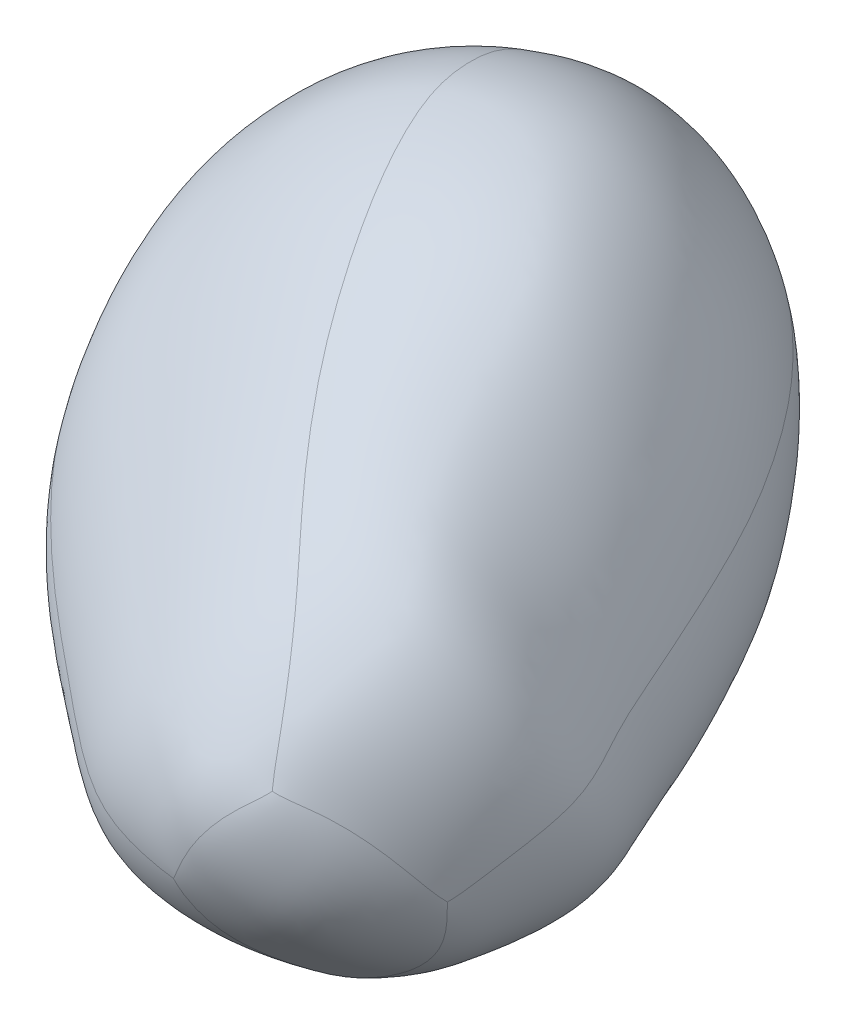
ISO-10303-21;
HEADER;
FILE_DESCRIPTION(('STEP AP214'),'2;1');
FILE_NAME('part.step','',(''),(''),'','','');
FILE_SCHEMA(('AUTOMOTIVE_DESIGN { 1 0 10303 214 1 1 1 1 }'));
ENDSEC;
DATA;
#1=APPLICATION_CONTEXT('core data for automotive mechanical design processes');
#2=APPLICATION_PROTOCOL_DEFINITION('international standard','automotive_design',2000,#1);
#3=PRODUCT_CONTEXT('',#1,'mechanical');
#4=PRODUCT('Part','Part','',(#3));
#5=PRODUCT_RELATED_PRODUCT_CATEGORY('part','',(#4));
#6=PRODUCT_DEFINITION_FORMATION('','',#4);
#7=PRODUCT_DEFINITION_CONTEXT('part definition',#1,'design');
#8=PRODUCT_DEFINITION('design','',#6,#7);
#9=PRODUCT_DEFINITION_SHAPE('','',#8);
#10=(LENGTH_UNIT() NAMED_UNIT(*) SI_UNIT(.MILLI.,.METRE.));
#11=(NAMED_UNIT(*) PLANE_ANGLE_UNIT() SI_UNIT($,.RADIAN.));
#12=(NAMED_UNIT(*) SI_UNIT($,.STERADIAN.) SOLID_ANGLE_UNIT());
#13=UNCERTAINTY_MEASURE_WITH_UNIT(LENGTH_MEASURE(1.E-05),#10,'distance_accuracy_value','');
#14=(GEOMETRIC_REPRESENTATION_CONTEXT(3) GLOBAL_UNCERTAINTY_ASSIGNED_CONTEXT((#13)) GLOBAL_UNIT_ASSIGNED_CONTEXT((#10,
#11,#12)) REPRESENTATION_CONTEXT('',''));
#15=CARTESIAN_POINT('',(0.,0.,0.));
#16=DIRECTION('',(0.,0.,1.));
#17=DIRECTION('',(1.,0.,0.));
#18=AXIS2_PLACEMENT_3D('',#15,#16,#17);
#19=CARTESIAN_POINT('',(686.42307031327,1282.70658301782,10.6137159882281));
#20=CARTESIAN_POINT('',(687.093359320476,1282.88845167643,10.5124909002232));
#21=CARTESIAN_POINT('',(689.11974156151,1283.61737322342,9.80751165139978));
#22=CARTESIAN_POINT('',(691.409772992094,1286.12112301742,9.66457967253436));
#23=CARTESIAN_POINT('',(691.847781260431,1288.30020864483,10.2041518345806));
#24=CARTESIAN_POINT('',(691.908236754202,1288.99312485369,10.2386744504557));
#25=CARTESIAN_POINT('',(686.115027827067,1282.34400760316,10.1532002396977));
#26=CARTESIAN_POINT('',(687.147563355298,1282.34516950573,9.49023431512453));
#27=CARTESIAN_POINT('',(689.349760689077,1282.987093374,8.47884662684672));
#28=CARTESIAN_POINT('',(691.878025380256,1285.66923894261,8.35128505110497));
#29=CARTESIAN_POINT('',(692.253861110074,1288.04232415578,9.23257304929468));
#30=CARTESIAN_POINT('',(692.141504425904,1289.21064071361,9.77014636576151));
#31=CARTESIAN_POINT('',(684.674793224592,1281.17037499915,8.51636580715845));
#32=CARTESIAN_POINT('',(686.053877682199,1281.2763679107,7.70587135817448));
#33=CARTESIAN_POINT('',(689.07628146738,1282.33061043738,6.48769559797422));
#34=CARTESIAN_POINT('',(692.568462721475,1285.91603725094,6.31862901243752));
#35=CARTESIAN_POINT('',(693.182061888707,1289.07143278038,7.4248764402125));
#36=CARTESIAN_POINT('',(693.080948389537,1290.59521286986,8.0725727323297));
#37=CARTESIAN_POINT('',(681.62061231489,1279.14040905118,4.519441837458));
#38=CARTESIAN_POINT('',(683.696444923081,1279.33799109366,3.40560383416856));
#39=CARTESIAN_POINT('',(688.337834167936,1280.9669559552,1.79120073045969));
#40=CARTESIAN_POINT('',(693.678949825072,1285.81656102006,1.47383613975093));
#41=CARTESIAN_POINT('',(694.383573107673,1290.21585172163,3.34519814375405));
#42=CARTESIAN_POINT('',(694.105533006172,1292.3726056407,4.31840341703705));
#43=CARTESIAN_POINT('',(677.084390460161,1279.13992205743,0.796386745733225));
#44=CARTESIAN_POINT('',(679.313401002265,1279.22385072072,-0.383193006441249));
#45=CARTESIAN_POINT('',(684.531539438082,1280.65945987021,-2.13024485323362));
#46=CARTESIAN_POINT('',(692.291966445199,1286.10749343849,-2.37142698518764));
#47=CARTESIAN_POINT('',(693.06950530246,1291.02745518633,0.13024900370124));
#48=CARTESIAN_POINT('',(692.674033524255,1293.47842946721,1.2638999119379));
#49=CARTESIAN_POINT('',(672.484577200245,1279.16026191205,-2.79933421640779));
#50=CARTESIAN_POINT('',(674.95896499065,1279.1836188254,-3.9769510942875));
#51=CARTESIAN_POINT('',(681.014562020059,1280.55356537326,-5.6538922689616));
#52=CARTESIAN_POINT('',(691.860205818583,1286.65299732351,-5.37522605763108));
#53=CARTESIAN_POINT('',(692.73475868284,1291.92647366369,-2.47700067788048));
#54=CARTESIAN_POINT('',(692.231092908019,1294.59932255777,-1.28735002253865));
#55=CARTESIAN_POINT('',(668.427303156297,1279.95237439194,-6.81679531787939));
#56=CARTESIAN_POINT('',(671.081930992762,1279.91131773508,-7.91985520026694));
#57=CARTESIAN_POINT('',(677.65017187525,1281.17329591244,-9.44517953415648));
#58=CARTESIAN_POINT('',(690.763037440246,1288.07073039361,-9.43400334074043));
#59=CARTESIAN_POINT('',(691.685355792556,1293.49354744794,-6.3126529139675));
#60=CARTESIAN_POINT('',(691.348511460417,1296.15804650495,-5.12736083194731));
#61=CARTESIAN_POINT('',(667.387609483974,1281.06365419277,-10.8102439889698));
#62=CARTESIAN_POINT('',(670.110346638847,1280.98769611355,-11.8602344080904));
#63=CARTESIAN_POINT('',(676.613106032121,1282.25951476404,-13.2865242069356));
#64=CARTESIAN_POINT('',(688.590492644378,1289.10045442592,-13.2297676401789));
#65=CARTESIAN_POINT('',(690.093182767126,1294.81222796778,-10.4858604701178));
#66=CARTESIAN_POINT('',(689.984030723453,1297.5277650008,-9.38893749880474));
#67=CARTESIAN_POINT('',(666.794557292955,1283.11108952992,-14.6488829629326));
#68=CARTESIAN_POINT('',(669.415621185025,1283.00496043293,-15.5803231880857));
#69=CARTESIAN_POINT('',(675.447401338654,1284.20730106353,-16.8186301077281));
#70=CARTESIAN_POINT('',(685.542329325615,1290.56518043082,-16.7198450454569));
#71=CARTESIAN_POINT('',(687.531635390836,1296.2097095623,-14.5244923058156));
#72=CARTESIAN_POINT('',(687.656966781302,1298.80693628763,-13.584342162781));
#73=CARTESIAN_POINT('',(666.142396134486,1285.2727541534,-17.4313910533137));
#74=CARTESIAN_POINT('',(668.556012245045,1285.19828926131,-18.2840528478854));
#75=CARTESIAN_POINT('',(674.110454692131,1286.32318803465,-19.5041791222781));
#76=CARTESIAN_POINT('',(682.728728563645,1292.07804161717,-19.3835993354634));
#77=CARTESIAN_POINT('',(684.763416231847,1297.21877557014,-17.6152649607486));
#78=CARTESIAN_POINT('',(684.96388994644,1299.58444970003,-16.794093568385));
#79=CARTESIAN_POINT('',(665.861840742017,1288.36086273501,-20.0211637369137));
#80=CARTESIAN_POINT('',(667.893272118608,1288.32345383737,-20.7333231701572));
#81=CARTESIAN_POINT('',(672.568190807586,1289.28950427258,-21.8469352137584));
#82=CARTESIAN_POINT('',(679.086199488033,1294.02478627881,-21.7133272644672));
#83=CARTESIAN_POINT('',(681.019010236151,1298.28959892131,-20.500008591166));
#84=CARTESIAN_POINT('',(681.280109575532,1300.25247951571,-19.8572553172423));
#85=CARTESIAN_POINT('',(665.552202152406,1291.47520187012,-21.11075548531));
#86=CARTESIAN_POINT('',(667.074517383024,1291.56756032128,-21.7331316109647));
#87=CARTESIAN_POINT('',(670.575651183506,1292.51845247839,-22.8887203523293));
#88=CARTESIAN_POINT('',(675.674213609201,1296.32445624559,-22.7112619158045));
#89=CARTESIAN_POINT('',(677.370348152599,1299.48599232112,-21.5684430502497));
#90=CARTESIAN_POINT('',(677.715680819372,1300.93547611513,-21.0155222701327));
#91=CARTESIAN_POINT('',(665.599045126847,1292.20958646704,-21.3218070627838));
#92=CARTESIAN_POINT('',(666.383624229383,1292.62295799107,-21.73852091437));
#93=CARTESIAN_POINT('',(669.697296505391,1293.90163041834,-22.9821586151857));
#94=CARTESIAN_POINT('',(674.263025687752,1297.33424445077,-22.7849384140113));
#95=CARTESIAN_POINT('',(676.267452294607,1300.29025487276,-21.6228744149442));
#96=CARTESIAN_POINT('',(676.865306025109,1300.98848988488,-21.2361167733014));
#97=(BOUNDED_SURFACE() B_SPLINE_SURFACE(3,3,((#19,#20,#21,#22,#23,#24),(#25,#26,#27,#28,#29,
#30),(#31,#32,#33,#34,#35,#36),(#37,#38,#39,#40,#41,#42),(#43,#44,#45,#46,#47,#48),(#49,#50,#51,
#52,#53,#54),(#55,#56,#57,#58,#59,#60),(#61,#62,#63,#64,#65,#66),(#67,#68,#69,#70,#71,#72),(#73,
#74,#75,#76,#77,#78),(#79,#80,#81,#82,#83,#84),(#85,#86,#87,#88,#89,#90),(#91,#92,#93,#94,#95,
#96)),.UNSPECIFIED.,.F.,.F.,.F.) B_SPLINE_SURFACE_WITH_KNOTS((4,1,1,1,1,1,1,1,1,1,4),(4,1,1,4),
(0.,1.,2.,3.,4.,5.,6.,7.,8.,9.,10.),(0.,1.,2.,3.),
.UNSPECIFIED.) GEOMETRIC_REPRESENTATION_ITEM() RATIONAL_B_SPLINE_SURFACE(((0.75,1.,1.,1.,1.,
0.75),(1.,1.,1.,1.,1.,1.),(1.,1.,1.,1.,1.,1.),(1.,1.,1.,1.,1.,1.),(1.,1.,1.,1.,1.,1.),(1.,1.,1.,
1.,1.,1.),(1.,1.,1.,1.,1.,1.),(1.,1.,1.,1.,1.,1.),(1.,1.,1.,1.,1.,1.),(1.,1.,1.,1.,1.,1.),(1.,
1.,1.,1.,1.,1.),(1.,1.,1.,1.,1.,1.),(0.75,1.,1.,1.,1.,0.75))) REPRESENTATION_ITEM('') SURFACE());
#98=CARTESIAN_POINT('',(686.42307031327,1282.70658301782,10.6137159882281));
#99=CARTESIAN_POINT('',(686.115027827067,1282.34400760316,10.1532002396977));
#100=CARTESIAN_POINT('',(684.674793224592,1281.17037499915,8.51636580715845));
#101=CARTESIAN_POINT('',(681.62061231489,1279.14040905118,4.519441837458));
#102=CARTESIAN_POINT('',(677.084390460161,1279.13992205743,0.796386745733225));
#103=CARTESIAN_POINT('',(672.484577200245,1279.16026191205,-2.79933421640779));
#104=CARTESIAN_POINT('',(668.427303156297,1279.95237439194,-6.81679531787939));
#105=CARTESIAN_POINT('',(667.387609483974,1281.06365419277,-10.8102439889698));
#106=CARTESIAN_POINT('',(666.794557292955,1283.11108952992,-14.6488829629326));
#107=CARTESIAN_POINT('',(666.142396134486,1285.2727541534,-17.4313910533137));
#108=CARTESIAN_POINT('',(665.861840742017,1288.36086273501,-20.0211637369137));
#109=CARTESIAN_POINT('',(665.552202152406,1291.47520187012,-21.11075548531));
#110=CARTESIAN_POINT('',(665.599045126847,1292.20958646704,-21.3218070627838));
#111=(BOUNDED_CURVE() B_SPLINE_CURVE(3,(#98,#99,#100,#101,#102,#103,#104,#105,#106,#107,#108,
#109,#110),.UNSPECIFIED.,.F.,.F.) B_SPLINE_CURVE_WITH_KNOTS((4,1,1,1,1,1,1,1,1,1,4),(0.,1.,2.,
3.,4.,5.,6.,7.,8.,9.,10.),
.UNSPECIFIED.) CURVE() GEOMETRIC_REPRESENTATION_ITEM() RATIONAL_B_SPLINE_CURVE((0.75,1.,1.,1.,
1.,1.,1.,1.,1.,1.,1.,1.,0.75)) REPRESENTATION_ITEM(''));
#112=CARTESIAN_POINT('',(665.599045126847,1292.20958646704,-21.3218070627839));
#113=VERTEX_POINT('',#112);
#114=CARTESIAN_POINT('',(686.42307031327,1282.70658301782,10.613715988228));
#115=VERTEX_POINT('',#114);
#116=EDGE_CURVE('E88',#113,#115,#111,.F.);
#117=CARTESIAN_POINT('',(665.599045126847,1292.20958646704,-21.3218070627838));
#118=CARTESIAN_POINT('',(666.383624229383,1292.62295799107,-21.73852091437));
#119=CARTESIAN_POINT('',(669.697296505391,1293.90163041834,-22.9821586151857));
#120=CARTESIAN_POINT('',(674.263025687752,1297.33424445077,-22.7849384140113));
#121=CARTESIAN_POINT('',(676.267452294607,1300.29025487276,-21.6228744149442));
#122=CARTESIAN_POINT('',(676.865306025109,1300.98848988488,-21.2361167733014));
#123=(BOUNDED_CURVE() B_SPLINE_CURVE(3,(#117,#118,#119,#120,#121,#122),.UNSPECIFIED.,.F.,
.F.) B_SPLINE_CURVE_WITH_KNOTS((4,1,1,4),(0.,1.,2.,3.),
.UNSPECIFIED.) CURVE() GEOMETRIC_REPRESENTATION_ITEM() RATIONAL_B_SPLINE_CURVE((0.75,1.,1.,1.,
1.,0.75)) REPRESENTATION_ITEM(''));
#124=CARTESIAN_POINT('',(676.865306025109,1300.98848988488,-21.2361167733014));
#125=VERTEX_POINT('',#124);
#126=EDGE_CURVE('E90',#125,#113,#123,.F.);
#127=CARTESIAN_POINT('',(676.865306025109,1300.98848988488,-21.2361167733014));
#128=CARTESIAN_POINT('',(677.715680819372,1300.93547611513,-21.0155222701327));
#129=CARTESIAN_POINT('',(681.280109575532,1300.25247951571,-19.8572553172423));
#130=CARTESIAN_POINT('',(684.96388994644,1299.58444970003,-16.794093568385));
#131=CARTESIAN_POINT('',(687.656966781302,1298.80693628763,-13.584342162781));
#132=CARTESIAN_POINT('',(689.984030723453,1297.5277650008,-9.38893749880474));
#133=CARTESIAN_POINT('',(691.348511460417,1296.15804650495,-5.12736083194731));
#134=CARTESIAN_POINT('',(692.231092908019,1294.59932255777,-1.28735002253865));
#135=CARTESIAN_POINT('',(692.674033524255,1293.47842946721,1.2638999119379));
#136=CARTESIAN_POINT('',(694.105533006172,1292.3726056407,4.31840341703705));
#137=CARTESIAN_POINT('',(693.080948389537,1290.59521286986,8.0725727323297));
#138=CARTESIAN_POINT('',(692.141504425904,1289.21064071361,9.77014636576151));
#139=CARTESIAN_POINT('',(691.908236754202,1288.99312485369,10.2386744504557));
#140=(BOUNDED_CURVE() B_SPLINE_CURVE(3,(#127,#128,#129,#130,#131,#132,#133,#134,#135,#136,#137,
#138,#139),.UNSPECIFIED.,.F.,.F.) B_SPLINE_CURVE_WITH_KNOTS((4,1,1,1,1,1,1,1,1,1,4),(0.,1.,2.,
3.,4.,5.,6.,7.,8.,9.,10.),
.UNSPECIFIED.) CURVE() GEOMETRIC_REPRESENTATION_ITEM() RATIONAL_B_SPLINE_CURVE((0.75,1.,1.,1.,
1.,1.,1.,1.,1.,1.,1.,1.,0.75)) REPRESENTATION_ITEM(''));
#141=CARTESIAN_POINT('',(691.908236754202,1288.99312485369,10.2386744504559));
#142=VERTEX_POINT('',#141);
#143=EDGE_CURVE('E132',#142,#125,#140,.F.);
#144=CARTESIAN_POINT('',(691.908236754202,1288.99312485369,10.2386744504557));
#145=CARTESIAN_POINT('',(691.847781260431,1288.30020864483,10.2041518345806));
#146=CARTESIAN_POINT('',(691.409772992094,1286.12112301742,9.66457967253436));
#147=CARTESIAN_POINT('',(689.11974156151,1283.61737322342,9.80751165139978));
#148=CARTESIAN_POINT('',(687.093359320476,1282.88845167643,10.5124909002232));
#149=CARTESIAN_POINT('',(686.42307031327,1282.70658301782,10.6137159882281));
#150=(BOUNDED_CURVE() B_SPLINE_CURVE(3,(#144,#145,#146,#147,#148,#149),.UNSPECIFIED.,.F.,
.F.) B_SPLINE_CURVE_WITH_KNOTS((4,1,1,4),(0.,1.,2.,3.),
.UNSPECIFIED.) CURVE() GEOMETRIC_REPRESENTATION_ITEM() RATIONAL_B_SPLINE_CURVE((0.75,1.,1.,1.,
1.,0.75)) REPRESENTATION_ITEM(''));
#151=EDGE_CURVE('E92',#115,#142,#150,.F.);
#152=ORIENTED_EDGE('',*,*,#116,.F.);
#153=ORIENTED_EDGE('',*,*,#126,.F.);
#154=ORIENTED_EDGE('',*,*,#143,.F.);
#155=ORIENTED_EDGE('',*,*,#151,.F.);
#156=EDGE_LOOP('',(#152,#153,#154,#155));
#157=FACE_BOUND('',#156,.T.);
#158=ADVANCED_FACE('F39',(#157),#97,.T.);
#159=CARTESIAN_POINT('',(665.599045126847,1292.20958646704,-21.3218070627838));
#160=CARTESIAN_POINT('',(666.383624229383,1292.62295799107,-21.73852091437));
#161=CARTESIAN_POINT('',(669.697296505391,1293.90163041834,-22.9821586151857));
#162=CARTESIAN_POINT('',(674.263025687752,1297.33424445077,-22.7849384140113));
#163=CARTESIAN_POINT('',(676.267452294607,1300.29025487276,-21.6228744149442));
#164=CARTESIAN_POINT('',(676.865306025109,1300.98848988488,-21.2361167733014));
#165=CARTESIAN_POINT('',(664.861308998775,1292.5305995399,-21.1161447886934));
#166=CARTESIAN_POINT('',(665.692731075752,1293.67835566085,-21.7439102177536));
#167=CARTESIAN_POINT('',(668.818941827275,1295.28480835828,-23.0755968780314));
#168=CARTESIAN_POINT('',(672.851837766314,1298.34403265595,-22.8586149122182));
#169=CARTESIAN_POINT('',(675.164556436605,1301.09451742441,-21.6773057796383));
#170=CARTESIAN_POINT('',(676.612784961369,1301.73973866677,-21.0699536348272));
#171=CARTESIAN_POINT('',(662.594836498293,1293.31007081372,-19.9600612944238));
#172=CARTESIAN_POINT('',(663.747913196769,1294.65583985604,-20.7656589905348));
#173=CARTESIAN_POINT('',(667.298062738882,1297.58857191229,-22.4075647909085));
#174=CARTESIAN_POINT('',(670.61907195935,1300.08351550989,-22.1553862537411));
#175=CARTESIAN_POINT('',(674.401635088155,1303.11517423123,-20.8265967793212));
#176=CARTESIAN_POINT('',(676.073922348974,1304.06826662044,-20.1101670071905));
#177=CARTESIAN_POINT('',(660.927119678383,1295.8838019212,-18.101294610421));
#178=CARTESIAN_POINT('',(662.119204937637,1296.95334069507,-19.0722437315506));
#179=CARTESIAN_POINT('',(665.310669677214,1300.01288275127,-20.4529391613199));
#180=CARTESIAN_POINT('',(668.406225788064,1302.37001131729,-20.3501247807699));
#181=CARTESIAN_POINT('',(672.190913056417,1305.11891478917,-19.4079071826172));
#182=CARTESIAN_POINT('',(673.525985730142,1306.2565194571,-18.7071042171986));
#183=CARTESIAN_POINT('',(661.021368555583,1298.02200531107,-17.1648266281831));
#184=CARTESIAN_POINT('',(661.912592819196,1298.76462967687,-18.0205717449887));
#185=CARTESIAN_POINT('',(663.929530714705,1301.31003090757,-18.4390916422406));
#186=CARTESIAN_POINT('',(667.336910580041,1303.93556943291,-18.4452870316464));
#187=CARTESIAN_POINT('',(670.327579912136,1305.58497800039,-18.3388029596016));
#188=CARTESIAN_POINT('',(671.227745849942,1306.49449886068,-17.7494864617531));
#189=CARTESIAN_POINT('',(661.047418722652,1298.61712381255,-16.7165866865932));
#190=CARTESIAN_POINT('',(661.506055937977,1299.28599524618,-16.9203392741847));
#191=CARTESIAN_POINT('',(663.286344714103,1301.85411683279,-17.0512565037107));
#192=CARTESIAN_POINT('',(666.878110123897,1304.74329700163,-17.188432295813));
#193=CARTESIAN_POINT('',(669.820787727251,1306.18731560157,-17.4036991797863));
#194=CARTESIAN_POINT('',(670.589829080746,1306.59288364137,-17.3225227744961));
#195=(BOUNDED_SURFACE() B_SPLINE_SURFACE(3,3,((#159,#160,#161,#162,#163,#164),(#165,#166,#167,
#168,#169,#170),(#171,#172,#173,#174,#175,#176),(#177,#178,#179,#180,#181,#182),(#183,#184,#185,
#186,#187,#188),(#189,#190,#191,#192,#193,#194)),.UNSPECIFIED.,.F.,.F.,
.F.) B_SPLINE_SURFACE_WITH_KNOTS((4,1,1,4),(4,1,1,4),(0.,1.,2.,3.),(0.,1.,2.,3.),
.UNSPECIFIED.) GEOMETRIC_REPRESENTATION_ITEM() RATIONAL_B_SPLINE_SURFACE(((0.75,1.,1.,1.,1.,
0.75),(1.,1.,1.,1.,1.,1.),(1.,1.,1.,1.,1.,1.),(1.,1.,1.,1.,1.,1.),(1.,1.,1.,1.,1.,1.),(0.75,1.,
1.,1.,1.,0.75))) REPRESENTATION_ITEM('') SURFACE());
#196=CARTESIAN_POINT('',(661.047418722652,1298.61712381255,-16.7165866865932));
#197=CARTESIAN_POINT('',(661.021368555583,1298.02200531107,-17.1648266281831));
#198=CARTESIAN_POINT('',(660.927119678383,1295.8838019212,-18.101294610421));
#199=CARTESIAN_POINT('',(662.594836498293,1293.31007081372,-19.9600612944238));
#200=CARTESIAN_POINT('',(664.861308998775,1292.5305995399,-21.1161447886934));
#201=CARTESIAN_POINT('',(665.599045126847,1292.20958646704,-21.3218070627838));
#202=(BOUNDED_CURVE() B_SPLINE_CURVE(3,(#196,#197,#198,#199,#200,#201),.UNSPECIFIED.,.F.,
.F.) B_SPLINE_CURVE_WITH_KNOTS((4,1,1,4),(0.,1.,2.,3.),
.UNSPECIFIED.) CURVE() GEOMETRIC_REPRESENTATION_ITEM() RATIONAL_B_SPLINE_CURVE((0.75,1.,1.,1.,
1.,0.75)) REPRESENTATION_ITEM(''));
#203=CARTESIAN_POINT('',(661.047418722652,1298.61712381255,-16.7165866865931));
#204=VERTEX_POINT('',#203);
#205=EDGE_CURVE('E98',#204,#113,#202,.T.);
#206=CARTESIAN_POINT('',(661.047418722652,1298.61712381255,-16.7165866865932));
#207=CARTESIAN_POINT('',(661.506055937977,1299.28599524618,-16.9203392741847));
#208=CARTESIAN_POINT('',(663.286344714103,1301.85411683279,-17.0512565037107));
#209=CARTESIAN_POINT('',(666.878110123897,1304.74329700163,-17.188432295813));
#210=CARTESIAN_POINT('',(669.820787727251,1306.18731560157,-17.4036991797863));
#211=CARTESIAN_POINT('',(670.589829080746,1306.59288364137,-17.3225227744961));
#212=(BOUNDED_CURVE() B_SPLINE_CURVE(3,(#206,#207,#208,#209,#210,#211),.UNSPECIFIED.,.F.,
.F.) B_SPLINE_CURVE_WITH_KNOTS((4,1,1,4),(0.,1.,2.,3.),
.UNSPECIFIED.) CURVE() GEOMETRIC_REPRESENTATION_ITEM() RATIONAL_B_SPLINE_CURVE((0.75,1.,1.,1.,
1.,0.75)) REPRESENTATION_ITEM(''));
#213=CARTESIAN_POINT('',(670.589829080746,1306.59288364137,-17.3225227744959));
#214=VERTEX_POINT('',#213);
#215=EDGE_CURVE('E64',#214,#204,#212,.F.);
#216=CARTESIAN_POINT('',(670.589829080746,1306.59288364137,-17.3225227744961));
#217=CARTESIAN_POINT('',(671.227745849942,1306.49449886068,-17.7494864617531));
#218=CARTESIAN_POINT('',(673.525985730142,1306.2565194571,-18.7071042171986));
#219=CARTESIAN_POINT('',(676.073922348974,1304.06826662044,-20.1101670071905));
#220=CARTESIAN_POINT('',(676.612784961369,1301.73973866677,-21.0699536348272));
#221=CARTESIAN_POINT('',(676.865306025109,1300.98848988488,-21.2361167733014));
#222=(BOUNDED_CURVE() B_SPLINE_CURVE(3,(#216,#217,#218,#219,#220,#221),.UNSPECIFIED.,.F.,
.F.) B_SPLINE_CURVE_WITH_KNOTS((4,1,1,4),(0.,1.,2.,3.),
.UNSPECIFIED.) CURVE() GEOMETRIC_REPRESENTATION_ITEM() RATIONAL_B_SPLINE_CURVE((0.75,1.,1.,1.,
1.,0.75)) REPRESENTATION_ITEM(''));
#223=EDGE_CURVE('E103',#125,#214,#222,.F.);
#224=ORIENTED_EDGE('',*,*,#205,.F.);
#225=ORIENTED_EDGE('',*,*,#215,.F.);
#226=ORIENTED_EDGE('',*,*,#223,.F.);
#227=ORIENTED_EDGE('',*,*,#126,.T.);
#228=EDGE_LOOP('',(#224,#225,#226,#227));
#229=FACE_BOUND('',#228,.T.);
#230=ADVANCED_FACE('F101',(#229),#195,.T.);
#231=CARTESIAN_POINT('',(670.589829080746,1306.59288364137,-17.3225227744961));
#232=CARTESIAN_POINT('',(671.227745849942,1306.49449886068,-17.7494864617531));
#233=CARTESIAN_POINT('',(673.525985730142,1306.2565194571,-18.7071042171986));
#234=CARTESIAN_POINT('',(676.073922348974,1304.06826662044,-20.1101670071905));
#235=CARTESIAN_POINT('',(676.612784961369,1301.73973866677,-21.0699536348272));
#236=CARTESIAN_POINT('',(676.865306025109,1300.98848988488,-21.2361167733014));
#237=CARTESIAN_POINT('',(670.720953665057,1307.09683646185,-16.8143826819267));
#238=CARTESIAN_POINT('',(672.127911787737,1307.40401972097,-17.1601699638935));
#239=CARTESIAN_POINT('',(674.861058403878,1307.39412412505,-18.0063012517581));
#240=CARTESIAN_POINT('',(677.746209609804,1305.02135900966,-19.3937372350596));
#241=CARTESIAN_POINT('',(678.061013486134,1302.38495990913,-20.462601490016));
#242=CARTESIAN_POINT('',(677.715680819372,1300.93547611513,-21.0155222701327));
#243=CARTESIAN_POINT('',(670.944033076996,1309.06281749537,-14.3533362740853));
#244=CARTESIAN_POINT('',(672.737906206887,1309.39269459459,-14.9093880444896));
#245=CARTESIAN_POINT('',(676.416661830466,1309.19563932491,-16.1453069881818));
#246=CARTESIAN_POINT('',(680.652795524288,1305.80206984516,-17.8568076209463));
#247=CARTESIAN_POINT('',(681.541208914902,1302.2153601101,-19.2145020433293));
#248=CARTESIAN_POINT('',(681.280109575532,1300.25247951571,-19.8572553172423));
#249=CARTESIAN_POINT('',(671.937882740687,1310.40010931867,-10.8478062744653));
#250=CARTESIAN_POINT('',(674.051409844903,1310.87522719684,-11.5544576899473));
#251=CARTESIAN_POINT('',(678.562514840579,1310.82691931505,-13.1141200606018));
#252=CARTESIAN_POINT('',(683.931570851268,1306.27208639658,-14.456570981239));
#253=CARTESIAN_POINT('',(685.164363661043,1301.95012382994,-15.9729221760106));
#254=CARTESIAN_POINT('',(684.96388994644,1299.58444970003,-16.794093568385));
#255=CARTESIAN_POINT('',(672.88387804541,1310.84502021487,-7.62610055269978));
#256=CARTESIAN_POINT('',(675.164087056061,1311.43098691619,-8.43220271865463));
#257=CARTESIAN_POINT('',(680.181031279617,1311.53494884188,-10.2027217021333));
#258=CARTESIAN_POINT('',(686.294317668331,1306.14854078278,-11.0789441872717));
#259=CARTESIAN_POINT('',(687.782298171746,1301.40416301295,-12.6441920197576));
#260=CARTESIAN_POINT('',(687.656966781302,1298.80693628763,-13.584342162781));
#261=CARTESIAN_POINT('',(674.488868820015,1310.39106195099,-3.86627244743356));
#262=CARTESIAN_POINT('',(676.787505639566,1311.14212824833,-4.72361680514744));
#263=CARTESIAN_POINT('',(681.890227397064,1311.52904778342,-6.56089544698241));
#264=CARTESIAN_POINT('',(687.935580382311,1305.39367662409,-6.64822981232205));
#265=CARTESIAN_POINT('',(689.874878679778,1300.24330203384,-8.29201452750253));
#266=CARTESIAN_POINT('',(689.984030723453,1297.5277650008,-9.38893749880474));
#267=CARTESIAN_POINT('',(676.097565101013,1309.04436304531,-0.384664456419603));
#268=CARTESIAN_POINT('',(678.271284537343,1309.91369298995,-1.2397861878665));
#269=CARTESIAN_POINT('',(683.141643450229,1310.55946606653,-3.029271360949));
#270=CARTESIAN_POINT('',(688.741971447369,1304.05772473561,-2.3222508486194));
#271=CARTESIAN_POINT('',(691.011667128267,1298.82254556194,-3.94206874992714));
#272=CARTESIAN_POINT('',(691.348511460417,1296.15804650495,-5.12736083194731));
#273=CARTESIAN_POINT('',(678.366338146979,1306.6802948871,3.89118307542494));
#274=CARTESIAN_POINT('',(679.982038674591,1307.42873383224,3.25533363794241));
#275=CARTESIAN_POINT('',(683.422135555991,1307.73371865527,2.5076784400236));
#276=CARTESIAN_POINT('',(688.838211169693,1302.69009068794,1.76267787439843));
#277=CARTESIAN_POINT('',(691.727427133199,1297.27217145183,-0.0976993671968074));
#278=CARTESIAN_POINT('',(692.231092908019,1294.59932255777,-1.28735002253865));
#279=CARTESIAN_POINT('',(681.146144985841,1303.66508909501,7.82821701380233));
#280=CARTESIAN_POINT('',(682.44449839534,1304.32821615303,7.11660518473597));
#281=CARTESIAN_POINT('',(685.206127665448,1304.74582342114,5.98990689893584));
#282=CARTESIAN_POINT('',(689.919135775932,1300.81333912379,4.43047846427386));
#283=CARTESIAN_POINT('',(692.278561746039,1295.92940374811,2.39755082018215));
#284=CARTESIAN_POINT('',(692.674033524255,1293.47842946721,1.2638999119379));
#285=CARTESIAN_POINT('',(684.578605850345,1301.01289873917,11.5169947311926));
#286=CARTESIAN_POINT('',(685.716997854971,1301.60385800503,10.7311211186659));
#287=CARTESIAN_POINT('',(688.174353886101,1302.02317118254,9.3429985921333));
#288=CARTESIAN_POINT('',(692.010709216123,1298.75708453445,7.31306777942851));
#289=CARTESIAN_POINT('',(693.827492904682,1294.52935955977,5.29160869032012));
#290=CARTESIAN_POINT('',(694.105533006172,1292.3726056407,4.31840341703705));
#291=CARTESIAN_POINT('',(686.370665374344,1297.3681317888,14.1240545589021));
#292=CARTESIAN_POINT('',(687.30194850851,1297.66487851312,13.5106548352218));
#293=CARTESIAN_POINT('',(689.25544236541,1297.60839530045,12.2415893336684));
#294=CARTESIAN_POINT('',(691.961781726454,1295.05871778782,10.2048067650525));
#295=CARTESIAN_POINT('',(692.979834890367,1292.11899295934,8.72026902442474));
#296=CARTESIAN_POINT('',(693.080948389537,1290.59521286986,8.0725727323297));
#297=CARTESIAN_POINT('',(686.700075233073,1295.03303507687,15.0642941479778));
#298=CARTESIAN_POINT('',(687.446478836597,1295.15514695938,14.555122428096));
#299=CARTESIAN_POINT('',(689.024605441068,1294.87863388678,13.4342919655383));
#300=CARTESIAN_POINT('',(691.20388527528,1292.67913828956,11.5767249498617));
#301=CARTESIAN_POINT('',(692.029147741756,1290.37895727144,10.3077196822171));
#302=CARTESIAN_POINT('',(692.141504425904,1289.21064071361,9.77014636576151));
#303=CARTESIAN_POINT('',(686.845616049712,1294.49001666779,15.2601974931677));
#304=CARTESIAN_POINT('',(687.291588259776,1294.27956340451,15.1035633058163));
#305=CARTESIAN_POINT('',(688.868545273959,1293.67289773134,14.0304668259206));
#306=CARTESIAN_POINT('',(690.836746386299,1291.60724227489,12.2423232791959));
#307=CARTESIAN_POINT('',(691.735424576261,1289.46852520266,10.7417251510472));
#308=CARTESIAN_POINT('',(691.908236754202,1288.99312485369,10.2386744504557));
#309=(BOUNDED_SURFACE() B_SPLINE_SURFACE(3,3,((#231,#232,#233,#234,#235,#236),(#237,#238,#239,
#240,#241,#242),(#243,#244,#245,#246,#247,#248),(#249,#250,#251,#252,#253,#254),(#255,#256,#257,
#258,#259,#260),(#261,#262,#263,#264,#265,#266),(#267,#268,#269,#270,#271,#272),(#273,#274,#275,
#276,#277,#278),(#279,#280,#281,#282,#283,#284),(#285,#286,#287,#288,#289,#290),(#291,#292,#293,
#294,#295,#296),(#297,#298,#299,#300,#301,#302),(#303,#304,#305,#306,#307,#308)),.UNSPECIFIED.,
.F.,.F.,.F.) B_SPLINE_SURFACE_WITH_KNOTS((4,1,1,1,1,1,1,1,1,1,4),(4,1,1,4),(0.,1.,2.,3.,4.,5.,
6.,7.,8.,9.,10.),(0.,1.,2.,3.),
.UNSPECIFIED.) GEOMETRIC_REPRESENTATION_ITEM() RATIONAL_B_SPLINE_SURFACE(((0.75,1.,1.,1.,1.,
0.75),(1.,1.,1.,1.,1.,1.),(1.,1.,1.,1.,1.,1.),(1.,1.,1.,1.,1.,1.),(1.,1.,1.,1.,1.,1.),(1.,1.,1.,
1.,1.,1.),(1.,1.,1.,1.,1.,1.),(1.,1.,1.,1.,1.,1.),(1.,1.,1.,1.,1.,1.),(1.,1.,1.,1.,1.,1.),(1.,
1.,1.,1.,1.,1.),(1.,1.,1.,1.,1.,1.),(0.75,1.,1.,1.,1.,0.75))) REPRESENTATION_ITEM('') SURFACE());
#310=CARTESIAN_POINT('',(670.589829080746,1306.59288364137,-17.3225227744961));
#311=CARTESIAN_POINT('',(670.720953665057,1307.09683646185,-16.8143826819267));
#312=CARTESIAN_POINT('',(670.944033076996,1309.06281749537,-14.3533362740853));
#313=CARTESIAN_POINT('',(671.937882740687,1310.40010931867,-10.8478062744653));
#314=CARTESIAN_POINT('',(672.88387804541,1310.84502021487,-7.62610055269978));
#315=CARTESIAN_POINT('',(674.488868820015,1310.39106195099,-3.86627244743356));
#316=CARTESIAN_POINT('',(676.097565101013,1309.04436304531,-0.384664456419603));
#317=CARTESIAN_POINT('',(678.366338146979,1306.6802948871,3.89118307542494));
#318=CARTESIAN_POINT('',(681.146144985841,1303.66508909501,7.82821701380233));
#319=CARTESIAN_POINT('',(684.578605850345,1301.01289873917,11.5169947311926));
#320=CARTESIAN_POINT('',(686.370665374344,1297.3681317888,14.1240545589021));
#321=CARTESIAN_POINT('',(686.700075233073,1295.03303507687,15.0642941479778));
#322=CARTESIAN_POINT('',(686.845616049712,1294.49001666779,15.2601974931677));
#323=(BOUNDED_CURVE() B_SPLINE_CURVE(3,(#310,#311,#312,#313,#314,#315,#316,#317,#318,#319,#320,
#321,#322),.UNSPECIFIED.,.F.,.F.) B_SPLINE_CURVE_WITH_KNOTS((4,1,1,1,1,1,1,1,1,1,4),(0.,1.,2.,
3.,4.,5.,6.,7.,8.,9.,10.),
.UNSPECIFIED.) CURVE() GEOMETRIC_REPRESENTATION_ITEM() RATIONAL_B_SPLINE_CURVE((0.75,1.,1.,1.,
1.,1.,1.,1.,1.,1.,1.,1.,0.75)) REPRESENTATION_ITEM(''));
#324=CARTESIAN_POINT('',(686.845616049712,1294.49001666779,15.2601974931676));
#325=VERTEX_POINT('',#324);
#326=EDGE_CURVE('E111',#325,#214,#323,.F.);
#327=CARTESIAN_POINT('',(686.845616049712,1294.49001666779,15.2601974931677));
#328=CARTESIAN_POINT('',(687.291588259776,1294.27956340451,15.1035633058163));
#329=CARTESIAN_POINT('',(688.868545273959,1293.67289773134,14.0304668259206));
#330=CARTESIAN_POINT('',(690.836746386299,1291.60724227489,12.2423232791959));
#331=CARTESIAN_POINT('',(691.735424576261,1289.46852520266,10.7417251510472));
#332=CARTESIAN_POINT('',(691.908236754202,1288.99312485369,10.2386744504557));
#333=(BOUNDED_CURVE() B_SPLINE_CURVE(3,(#327,#328,#329,#330,#331,#332),.UNSPECIFIED.,.F.,
.F.) B_SPLINE_CURVE_WITH_KNOTS((4,1,1,4),(0.,1.,2.,3.),
.UNSPECIFIED.) CURVE() GEOMETRIC_REPRESENTATION_ITEM() RATIONAL_B_SPLINE_CURVE((0.75,1.,1.,1.,
1.,0.75)) REPRESENTATION_ITEM(''));
#334=EDGE_CURVE('E141',#142,#325,#333,.F.);
#335=ORIENTED_EDGE('',*,*,#326,.F.);
#336=ORIENTED_EDGE('',*,*,#334,.F.);
#337=ORIENTED_EDGE('',*,*,#143,.T.);
#338=ORIENTED_EDGE('',*,*,#223,.T.);
#339=EDGE_LOOP('',(#335,#336,#337,#338));
#340=FACE_BOUND('',#339,.T.);
#341=ADVANCED_FACE('F174',(#340),#309,.T.);
#342=CARTESIAN_POINT('',(686.845616049712,1294.49001666779,15.2601974931677));
#343=CARTESIAN_POINT('',(687.291588259776,1294.27956340451,15.1035633058163));
#344=CARTESIAN_POINT('',(688.868545273959,1293.67289773134,14.0304668259206));
#345=CARTESIAN_POINT('',(690.836746386299,1291.60724227489,12.2423232791959));
#346=CARTESIAN_POINT('',(691.735424576261,1289.46852520266,10.7417251510472));
#347=CARTESIAN_POINT('',(691.908236754202,1288.99312485369,10.2386744504557));
#348=CARTESIAN_POINT('',(686.545184656252,1294.15745152201,15.6127350256981));
#349=CARTESIAN_POINT('',(687.136697682954,1293.40397984964,15.6520041835583));
#350=CARTESIAN_POINT('',(688.712485106872,1292.46716157589,14.6266416863136));
#351=CARTESIAN_POINT('',(690.469607497307,1290.53534626022,12.9079216085192));
#352=CARTESIAN_POINT('',(691.441701410766,1288.55809313386,11.1757306198772));
#353=CARTESIAN_POINT('',(691.847781260431,1288.30020864483,10.2041518345806));
#354=CARTESIAN_POINT('',(685.321406787016,1293.23697316066,16.4720974214763));
#355=CARTESIAN_POINT('',(686.096629754074,1292.32798372954,16.454872558189));
#356=CARTESIAN_POINT('',(688.043106069301,1290.29058491336,15.4722109526075));
#357=CARTESIAN_POINT('',(689.482973099016,1288.54394824541,13.8519691976491));
#358=CARTESIAN_POINT('',(690.941520603932,1286.57300709224,10.9778742939856));
#359=CARTESIAN_POINT('',(691.409772992094,1286.12112301742,9.66457967253436));
#360=CARTESIAN_POINT('',(683.641126197463,1290.9297124762,17.0556737935272));
#361=CARTESIAN_POINT('',(684.470439792285,1290.14640443905,16.9332263580957));
#362=CARTESIAN_POINT('',(686.116923076705,1287.8242241053,15.8420215905105));
#363=CARTESIAN_POINT('',(687.420191408453,1286.02889607955,14.1132582019278));
#364=CARTESIAN_POINT('',(688.889722433942,1284.24765307286,11.1361766759636));
#365=CARTESIAN_POINT('',(689.11974156151,1283.61737322342,9.80751165139978));
#366=CARTESIAN_POINT('',(682.789516570008,1289.09413943542,16.7423360271308));
#367=CARTESIAN_POINT('',(683.468576523923,1288.54247387434,16.6218050221407));
#368=CARTESIAN_POINT('',(684.096093822705,1286.53786090558,15.5683730695743));
#369=CARTESIAN_POINT('',(685.452678179763,1284.45266748062,13.4929833253254));
#370=CARTESIAN_POINT('',(687.039155285654,1283.43173384716,11.5347474853218));
#371=CARTESIAN_POINT('',(687.093359320476,1282.88845167643,10.5124909002232));
#372=CARTESIAN_POINT('',(682.44207861758,1288.58372061662,16.540122033537));
#373=CARTESIAN_POINT('',(682.607889618306,1288.05267842666,16.3787495342395));
#374=CARTESIAN_POINT('',(682.909072357556,1286.00105768323,15.282487670598));
#375=CARTESIAN_POINT('',(684.303612849702,1283.71639471963,12.9748127497562));
#376=CARTESIAN_POINT('',(686.060823792234,1282.88728977387,11.1754568247854));
#377=CARTESIAN_POINT('',(686.42307031327,1282.70658301782,10.6137159882281));
#378=(BOUNDED_SURFACE() B_SPLINE_SURFACE(3,3,((#342,#343,#344,#345,#346,#347),(#348,#349,#350,
#351,#352,#353),(#354,#355,#356,#357,#358,#359),(#360,#361,#362,#363,#364,#365),(#366,#367,#368,
#369,#370,#371),(#372,#373,#374,#375,#376,#377)),.UNSPECIFIED.,.F.,.F.,
.F.) B_SPLINE_SURFACE_WITH_KNOTS((4,1,1,4),(4,1,1,4),(0.,1.,2.,3.),(0.,1.,2.,3.),
.UNSPECIFIED.) GEOMETRIC_REPRESENTATION_ITEM() RATIONAL_B_SPLINE_SURFACE(((0.75,1.,1.,1.,1.,
0.75),(1.,1.,1.,1.,1.,1.),(1.,1.,1.,1.,1.,1.),(1.,1.,1.,1.,1.,1.),(1.,1.,1.,1.,1.,1.),(0.75,1.,
1.,1.,1.,0.75))) REPRESENTATION_ITEM('') SURFACE());
#379=CARTESIAN_POINT('',(682.44207861758,1288.58372061662,16.540122033537));
#380=CARTESIAN_POINT('',(682.789516570008,1289.09413943542,16.7423360271308));
#381=CARTESIAN_POINT('',(683.641126197463,1290.9297124762,17.0556737935272));
#382=CARTESIAN_POINT('',(685.321406787016,1293.23697316066,16.4720974214763));
#383=CARTESIAN_POINT('',(686.545184656252,1294.15745152201,15.6127350256981));
#384=CARTESIAN_POINT('',(686.845616049712,1294.49001666779,15.2601974931677));
#385=(BOUNDED_CURVE() B_SPLINE_CURVE(3,(#379,#380,#381,#382,#383,#384),.UNSPECIFIED.,.F.,
.F.) B_SPLINE_CURVE_WITH_KNOTS((4,1,1,4),(0.,1.,2.,3.),
.UNSPECIFIED.) CURVE() GEOMETRIC_REPRESENTATION_ITEM() RATIONAL_B_SPLINE_CURVE((0.75,1.,1.,1.,
1.,0.75)) REPRESENTATION_ITEM(''));
#386=CARTESIAN_POINT('',(682.442078617579,1288.58372061662,16.540122033537));
#387=VERTEX_POINT('',#386);
#388=EDGE_CURVE('E53',#387,#325,#385,.T.);
#389=CARTESIAN_POINT('',(682.44207861758,1288.58372061662,16.540122033537));
#390=CARTESIAN_POINT('',(682.607889618306,1288.05267842666,16.3787495342395));
#391=CARTESIAN_POINT('',(682.909072357556,1286.00105768323,15.282487670598));
#392=CARTESIAN_POINT('',(684.303612849702,1283.71639471963,12.9748127497562));
#393=CARTESIAN_POINT('',(686.060823792234,1282.88728977387,11.1754568247854));
#394=CARTESIAN_POINT('',(686.42307031327,1282.70658301782,10.6137159882281));
#395=(BOUNDED_CURVE() B_SPLINE_CURVE(3,(#389,#390,#391,#392,#393,#394),.UNSPECIFIED.,.F.,
.F.) B_SPLINE_CURVE_WITH_KNOTS((4,1,1,4),(0.,1.,2.,3.),
.UNSPECIFIED.) CURVE() GEOMETRIC_REPRESENTATION_ITEM() RATIONAL_B_SPLINE_CURVE((0.75,1.,1.,1.,
1.,0.75)) REPRESENTATION_ITEM(''));
#396=EDGE_CURVE('E99',#115,#387,#395,.F.);
#397=ORIENTED_EDGE('',*,*,#388,.F.);
#398=ORIENTED_EDGE('',*,*,#396,.F.);
#399=ORIENTED_EDGE('',*,*,#151,.T.);
#400=ORIENTED_EDGE('',*,*,#334,.T.);
#401=EDGE_LOOP('',(#397,#398,#399,#400));
#402=FACE_BOUND('',#401,.T.);
#403=ADVANCED_FACE('F170',(#402),#378,.T.);
#404=CARTESIAN_POINT('',(682.44207861758,1288.58372061662,16.540122033537));
#405=CARTESIAN_POINT('',(682.607889618306,1288.05267842666,16.3787495342395));
#406=CARTESIAN_POINT('',(682.909072357556,1286.00105768323,15.282487670598));
#407=CARTESIAN_POINT('',(684.303612849702,1283.71639471963,12.9748127497562));
#408=CARTESIAN_POINT('',(686.060823792234,1282.88728977387,11.1754568247854));
#409=CARTESIAN_POINT('',(686.42307031327,1282.70658301782,10.6137159882281));
#410=CARTESIAN_POINT('',(681.928829664391,1288.60434398775,16.4992805392188));
#411=CARTESIAN_POINT('',(681.7472027127,1287.56288297901,16.1356940463493));
#412=CARTESIAN_POINT('',(681.722050892407,1285.46425446087,14.9966022716435));
#413=CARTESIAN_POINT('',(683.154547519651,1282.98012195866,12.4566421741653));
#414=CARTESIAN_POINT('',(685.082492298826,1282.3428457006,10.8161661642488));
#415=CARTESIAN_POINT('',(686.115027827067,1282.34400760316,10.1532002396977));
#416=CARTESIAN_POINT('',(679.940001522417,1288.61113646697,16.2296538084724));
#417=CARTESIAN_POINT('',(679.58229365209,1287.29102520747,15.8213209740752));
#418=CARTESIAN_POINT('',(679.270769579302,1284.68679822556,14.473136740137));
#419=CARTESIAN_POINT('',(680.801774721649,1281.69465296812,11.3506622918778));
#420=CARTESIAN_POINT('',(683.295708766963,1281.06438208763,9.32686025613132));
#421=CARTESIAN_POINT('',(684.674793224592,1281.17037499915,8.51636580715845));
#422=CARTESIAN_POINT('',(676.145685792084,1288.98238016825,15.1688200897962));
#423=CARTESIAN_POINT('',(675.459278591354,1287.26647922778,14.682164523296));
#424=CARTESIAN_POINT('',(674.471559614924,1283.93605179919,12.9221314740401));
#425=CARTESIAN_POINT('',(675.882838518743,1279.78146370035,8.47422875022595));
#426=CARTESIAN_POINT('',(679.544779706687,1278.9428270087,5.63327984074738));
#427=CARTESIAN_POINT('',(681.62061231489,1279.14040905118,4.519441837458));
#428=CARTESIAN_POINT('',(671.61481191486,1290.31183700712,11.6892053597318));
#429=CARTESIAN_POINT('',(670.842374013798,1288.4357031636,11.2452827664816));
#430=CARTESIAN_POINT('',(669.695603577669,1284.79828318215,9.50938121180718));
#431=CARTESIAN_POINT('',(671.157476185491,1280.15588789045,4.94723365983839));
#432=CARTESIAN_POINT('',(674.855379918068,1279.05599339412,1.97596649791272));
#433=CARTESIAN_POINT('',(677.084390460161,1279.13992205743,0.796386745733225));
#434=CARTESIAN_POINT('',(667.012942136319,1291.5529799002,8.17614467314335));
#435=CARTESIAN_POINT('',(666.132465386013,1289.50152291925,7.78617135632341));
#436=CARTESIAN_POINT('',(664.799027907971,1285.52193339368,6.11428882359268));
#437=CARTESIAN_POINT('',(666.168235277583,1280.41342389314,1.41180899833175));
#438=CARTESIAN_POINT('',(670.01018940984,1279.13690499869,-1.6217173385171));
#439=CARTESIAN_POINT('',(672.484577200245,1279.16026191205,-2.79933421640779));
#440=CARTESIAN_POINT('',(662.482808419574,1293.12569710344,3.78148963419927));
#441=CARTESIAN_POINT('',(661.592856557531,1290.95680344894,3.37607504537927));
#442=CARTESIAN_POINT('',(660.27208373301,1286.76036756942,1.77864056486688));
#443=CARTESIAN_POINT('',(661.72240485646,1281.41963585362,-2.82682023983136));
#444=CARTESIAN_POINT('',(665.772675319832,1279.99343104879,-5.71373543549188));
#445=CARTESIAN_POINT('',(668.427303156297,1279.95237439194,-6.81679531787939));
#446=CARTESIAN_POINT('',(660.24319516756,1294.8283925688,-0.271824442493396));
#447=CARTESIAN_POINT('',(659.418370875789,1292.62599128884,-0.756089515809379));
#448=CARTESIAN_POINT('',(658.334427492671,1288.29353366494,-2.47018122702875));
#449=CARTESIAN_POINT('',(660.276683102914,1282.71526323934,-6.98658169221146));
#450=CARTESIAN_POINT('',(664.6648723291,1281.13961227199,-9.76025356984879));
#451=CARTESIAN_POINT('',(667.387609483974,1281.06365419277,-10.8102439889698));
#452=CARTESIAN_POINT('',(658.91856836765,1296.58613035641,-4.85595569617588));
#453=CARTESIAN_POINT('',(658.187378420047,1294.51031580341,-5.36043000180912));
#454=CARTESIAN_POINT('',(657.408032088171,1290.31198079949,-7.08430341196345));
#455=CARTESIAN_POINT('',(659.721017986235,1284.84407564547,-11.2299887568203));
#456=CARTESIAN_POINT('',(664.173493400885,1283.21721862691,-13.7174427377795));
#457=CARTESIAN_POINT('',(666.794557292955,1283.11108952992,-14.6488829629326));
#458=CARTESIAN_POINT('',(658.564773988781,1297.50655364444,-8.65040819987587));
#459=CARTESIAN_POINT('',(657.90071269481,1295.59256104967,-9.12838950708861));
#460=CARTESIAN_POINT('',(657.276453512145,1291.72406321839,-10.7088379014367));
#461=CARTESIAN_POINT('',(659.628758028771,1286.76997738719,-14.3882083547618));
#462=CARTESIAN_POINT('',(663.728780023928,1285.3472190455,-16.5787292587205));
#463=CARTESIAN_POINT('',(666.142396134486,1285.2727541534,-17.4313910533137));
#464=CARTESIAN_POINT('',(659.131084391649,1298.46790941187,-12.887734924105));
#465=CARTESIAN_POINT('',(658.582185132996,1296.85428471276,-13.304620941505));
#466=CARTESIAN_POINT('',(658.158158121746,1293.59565010796,-14.6272444345431));
#467=CARTESIAN_POINT('',(660.379602548038,1289.51395765838,-17.5739786142858));
#468=CARTESIAN_POINT('',(663.830409365415,1288.39827163264,-19.30900430367));
#469=CARTESIAN_POINT('',(665.861840742017,1288.36086273501,-20.0211637369137));
#470=CARTESIAN_POINT('',(660.614831674364,1298.54337088038,-16.0645941573791));
#471=CARTESIAN_POINT('',(660.13014429196,1297.27938094526,-16.3090815113994));
#472=CARTESIAN_POINT('',(659.73503441914,1294.81426314731,-17.1303454892916));
#473=CARTESIAN_POINT('',(661.441759799828,1291.9643017714,-19.1544635983237));
#474=CARTESIAN_POINT('',(664.029886921788,1291.38284341897,-20.4883793596332));
#475=CARTESIAN_POINT('',(665.552202152406,1291.47520187012,-21.11075548531));
#476=CARTESIAN_POINT('',(661.047418722652,1298.61712381255,-16.7165866865932));
#477=CARTESIAN_POINT('',(661.021368555583,1298.02200531107,-17.1648266281831));
#478=CARTESIAN_POINT('',(660.927119678383,1295.8838019212,-18.101294610421));
#479=CARTESIAN_POINT('',(662.594836498293,1293.31007081372,-19.9600612944238));
#480=CARTESIAN_POINT('',(664.861308998775,1292.5305995399,-21.1161447886934));
#481=CARTESIAN_POINT('',(665.599045126847,1292.20958646704,-21.3218070627838));
#482=(BOUNDED_SURFACE() B_SPLINE_SURFACE(3,3,((#404,#405,#406,#407,#408,#409),(#410,#411,#412,
#413,#414,#415),(#416,#417,#418,#419,#420,#421),(#422,#423,#424,#425,#426,#427),(#428,#429,#430,
#431,#432,#433),(#434,#435,#436,#437,#438,#439),(#440,#441,#442,#443,#444,#445),(#446,#447,#448,
#449,#450,#451),(#452,#453,#454,#455,#456,#457),(#458,#459,#460,#461,#462,#463),(#464,#465,#466,
#467,#468,#469),(#470,#471,#472,#473,#474,#475),(#476,#477,#478,#479,#480,#481)),.UNSPECIFIED.,
.F.,.F.,.F.) B_SPLINE_SURFACE_WITH_KNOTS((4,1,1,1,1,1,1,1,1,1,4),(4,1,1,4),(0.,1.,2.,3.,4.,5.,
6.,7.,8.,9.,10.),(0.,1.,2.,3.),
.UNSPECIFIED.) GEOMETRIC_REPRESENTATION_ITEM() RATIONAL_B_SPLINE_SURFACE(((0.75,1.,1.,1.,1.,
0.75),(1.,1.,1.,1.,1.,1.),(1.,1.,1.,1.,1.,1.),(1.,1.,1.,1.,1.,1.),(1.,1.,1.,1.,1.,1.),(1.,1.,1.,
1.,1.,1.),(1.,1.,1.,1.,1.,1.),(1.,1.,1.,1.,1.,1.),(1.,1.,1.,1.,1.,1.),(1.,1.,1.,1.,1.,1.),(1.,
1.,1.,1.,1.,1.),(1.,1.,1.,1.,1.,1.),(0.75,1.,1.,1.,1.,0.75))) REPRESENTATION_ITEM('') SURFACE());
#483=CARTESIAN_POINT('',(661.047418722652,1298.61712381255,-16.7165866865932));
#484=CARTESIAN_POINT('',(660.614831674364,1298.54337088038,-16.0645941573791));
#485=CARTESIAN_POINT('',(659.131084391649,1298.46790941187,-12.887734924105));
#486=CARTESIAN_POINT('',(658.564773988781,1297.50655364444,-8.65040819987587));
#487=CARTESIAN_POINT('',(658.91856836765,1296.58613035641,-4.85595569617588));
#488=CARTESIAN_POINT('',(660.24319516756,1294.8283925688,-0.271824442493396));
#489=CARTESIAN_POINT('',(662.482808419574,1293.12569710344,3.78148963419927));
#490=CARTESIAN_POINT('',(667.012942136319,1291.5529799002,8.17614467314335));
#491=CARTESIAN_POINT('',(671.61481191486,1290.31183700712,11.6892053597318));
#492=CARTESIAN_POINT('',(676.145685792084,1288.98238016825,15.1688200897962));
#493=CARTESIAN_POINT('',(679.940001522417,1288.61113646697,16.2296538084724));
#494=CARTESIAN_POINT('',(681.928829664391,1288.60434398775,16.4992805392188));
#495=CARTESIAN_POINT('',(682.44207861758,1288.58372061662,16.540122033537));
#496=(BOUNDED_CURVE() B_SPLINE_CURVE(3,(#483,#484,#485,#486,#487,#488,#489,#490,#491,#492,#493,
#494,#495),.UNSPECIFIED.,.F.,.F.) B_SPLINE_CURVE_WITH_KNOTS((4,1,1,1,1,1,1,1,1,1,4),(0.,1.,2.,
3.,4.,5.,6.,7.,8.,9.,10.),
.UNSPECIFIED.) CURVE() GEOMETRIC_REPRESENTATION_ITEM() RATIONAL_B_SPLINE_CURVE((0.75,1.,1.,1.,
1.,1.,1.,1.,1.,1.,1.,1.,0.75)) REPRESENTATION_ITEM(''));
#497=EDGE_CURVE('E11',#204,#387,#496,.T.);
#498=ORIENTED_EDGE('',*,*,#497,.F.);
#499=ORIENTED_EDGE('',*,*,#205,.T.);
#500=ORIENTED_EDGE('',*,*,#116,.T.);
#501=ORIENTED_EDGE('',*,*,#396,.T.);
#502=EDGE_LOOP('',(#498,#499,#500,#501));
#503=FACE_BOUND('',#502,.T.);
#504=ADVANCED_FACE('F107',(#503),#482,.T.);
#505=CARTESIAN_POINT('',(661.047418722652,1298.61712381255,-16.7165866865932));
#506=CARTESIAN_POINT('',(661.506055937977,1299.28599524618,-16.9203392741847));
#507=CARTESIAN_POINT('',(663.286344714103,1301.85411683279,-17.0512565037107));
#508=CARTESIAN_POINT('',(666.878110123897,1304.74329700163,-17.188432295813));
#509=CARTESIAN_POINT('',(669.820787727251,1306.18731560157,-17.4036991797863));
#510=CARTESIAN_POINT('',(670.589829080746,1306.59288364137,-17.3225227744961));
#511=CARTESIAN_POINT('',(660.614831674364,1298.54337088038,-16.0645941573791));
#512=CARTESIAN_POINT('',(661.099519056758,1299.80736081549,-15.8201068033698));
#513=CARTESIAN_POINT('',(662.643158713512,1302.398202758,-15.663421365181));
#514=CARTESIAN_POINT('',(666.419309667753,1305.55102457037,-15.9315775599793));
#515=CARTESIAN_POINT('',(669.313995542366,1306.78965320274,-16.4685953999601));
#516=CARTESIAN_POINT('',(670.720953665057,1307.09683646185,-16.8143826819267));
#517=CARTESIAN_POINT('',(659.131084391649,1298.46790941187,-12.887734924105));
#518=CARTESIAN_POINT('',(659.67998365029,1300.08153411096,-12.4708489067156));
#519=CARTESIAN_POINT('',(661.451553673615,1303.27739830257,-12.1259283301745));
#520=CARTESIAN_POINT('',(665.653423051179,1307.21637672965,-12.808996365768));
#521=CARTESIAN_POINT('',(669.150159947116,1308.73294039616,-13.7972845036921));
#522=CARTESIAN_POINT('',(670.944033076996,1309.06281749537,-14.3533362740853));
#523=CARTESIAN_POINT('',(658.564773988781,1297.50655364444,-8.65040819987587));
#524=CARTESIAN_POINT('',(659.228835282763,1299.42054623923,-8.17242689266329));
#525=CARTESIAN_POINT('',(661.260821276013,1303.2080187871,-7.84095005818261));
#526=CARTESIAN_POINT('',(665.881352215199,1307.976212046,-8.87421156773111));
#527=CARTESIAN_POINT('',(669.82435563645,1309.9249914405,-10.1411548589833));
#528=CARTESIAN_POINT('',(671.937882740687,1310.40010931867,-10.8478062744653));
#529=CARTESIAN_POINT('',(658.91856836765,1296.58613035641,-4.85595569617588));
#530=CARTESIAN_POINT('',(659.649758315253,1298.66194490942,-4.35148139055347));
#531=CARTESIAN_POINT('',(661.7951717738,1302.76686811753,-4.05745757821821));
#532=CARTESIAN_POINT('',(666.499777215744,1308.01914863395,-5.36610870635953));
#533=CARTESIAN_POINT('',(670.603669034759,1310.25905351355,-6.81999838674473));
#534=CARTESIAN_POINT('',(672.88387804541,1310.84502021487,-7.62610055269978));
#535=CARTESIAN_POINT('',(660.24319516756,1294.8283925688,-0.271824442493396));
#536=CARTESIAN_POINT('',(661.068019459321,1297.03079384875,0.21244063082234));
#537=CARTESIAN_POINT('',(663.283373243254,1301.50794134467,0.435409212863419));
#538=CARTESIAN_POINT('',(668.098406479761,1307.02264999952,-1.41682930073186));
#539=CARTESIAN_POINT('',(672.190232000454,1309.63999565367,-3.00892808973068));
#540=CARTESIAN_POINT('',(674.488868820015,1310.39106195099,-3.86627244743356));
#541=CARTESIAN_POINT('',(662.482808419574,1293.12569710344,3.78148963419927));
#542=CARTESIAN_POINT('',(663.372760281638,1295.29459075794,4.18690422300843));
#543=CARTESIAN_POINT('',(665.611794905342,1299.77372949637,4.21112809774376));
#544=CARTESIAN_POINT('',(670.099326832229,1305.34348639866,2.10145902769809));
#545=CARTESIAN_POINT('',(673.923845664673,1308.17503310066,0.470457275032806));
#546=CARTESIAN_POINT('',(676.097565101013,1309.04436304531,-0.384664456419603));
#547=CARTESIAN_POINT('',(667.012942136319,1291.5529799002,8.17614467314335));
#548=CARTESIAN_POINT('',(667.893418886603,1293.60443688115,8.56611798995249));
#549=CARTESIAN_POINT('',(670.081888409761,1297.83067527935,8.4541287244692));
#550=CARTESIAN_POINT('',(673.727932390365,1303.24308498445,6.32277506485321));
#551=CARTESIAN_POINT('',(676.750637619378,1305.93185594196,4.52703251289652));
#552=CARTESIAN_POINT('',(678.366338146979,1306.6802948871,3.89118307542494));
#553=CARTESIAN_POINT('',(671.61481191486,1290.31183700712,11.6892053597318));
#554=CARTESIAN_POINT('',(672.387249815911,1292.18797085063,12.133127952982));
#555=CARTESIAN_POINT('',(674.330230983963,1296.05508624324,12.1729167712966));
#556=CARTESIAN_POINT('',(677.416007208494,1300.76706107297,10.2595778732802));
#557=CARTESIAN_POINT('',(679.847791576352,1303.00196203697,8.53982884285778));
#558=CARTESIAN_POINT('',(681.146144985841,1303.66508909501,7.82821701380233));
#559=CARTESIAN_POINT('',(676.145685792084,1288.98238016825,15.1688200897962));
#560=CARTESIAN_POINT('',(676.832092992813,1290.69828110873,15.6554756562963));
#561=CARTESIAN_POINT('',(678.590002819247,1294.23145744205,15.8420648730516));
#562=CARTESIAN_POINT('',(681.344001858337,1298.47741558736,14.0582402672496));
#563=CARTESIAN_POINT('',(683.440213845709,1300.4219394733,12.3028683437193));
#564=CARTESIAN_POINT('',(684.578605850345,1301.01289873917,11.5169947311926));
#565=CARTESIAN_POINT('',(679.940001522417,1288.61113646697,16.2296538084724));
#566=CARTESIAN_POINT('',(680.297709392743,1289.93124772648,16.6379866428584));
#567=CARTESIAN_POINT('',(681.417016801274,1292.60746578261,16.9231337465194));
#568=CARTESIAN_POINT('',(683.667743560422,1295.82791495453,15.921987675739));
#569=CARTESIAN_POINT('',(685.439382240188,1297.07138506449,14.7374542825823));
#570=CARTESIAN_POINT('',(686.370665374344,1297.3681317888,14.1240545589021));
#571=CARTESIAN_POINT('',(681.928829664391,1288.60434398775,16.4992805392188));
#572=CARTESIAN_POINT('',(682.110456616104,1289.6458049965,16.8628670321209));
#573=CARTESIAN_POINT('',(682.811812602642,1291.71302051335,17.1781212289589));
#574=CARTESIAN_POINT('',(684.546183819959,1294.14596259179,16.4893222847633));
#575=CARTESIAN_POINT('',(685.953671629561,1294.91092319437,15.5734658678377));
#576=CARTESIAN_POINT('',(686.700075233073,1295.03303507687,15.0642941479778));
#577=CARTESIAN_POINT('',(682.44207861758,1288.58372061662,16.540122033537));
#578=CARTESIAN_POINT('',(682.789516570008,1289.09413943542,16.7423360271308));
#579=CARTESIAN_POINT('',(683.641126197463,1290.9297124762,17.0556737935272));
#580=CARTESIAN_POINT('',(685.321406787016,1293.23697316066,16.4720974214763));
#581=CARTESIAN_POINT('',(686.545184656252,1294.15745152201,15.6127350256981));
#582=CARTESIAN_POINT('',(686.845616049712,1294.49001666779,15.2601974931677));
#583=(BOUNDED_SURFACE() B_SPLINE_SURFACE(3,3,((#505,#506,#507,#508,#509,#510),(#511,#512,#513,
#514,#515,#516),(#517,#518,#519,#520,#521,#522),(#523,#524,#525,#526,#527,#528),(#529,#530,#531,
#532,#533,#534),(#535,#536,#537,#538,#539,#540),(#541,#542,#543,#544,#545,#546),(#547,#548,#549,
#550,#551,#552),(#553,#554,#555,#556,#557,#558),(#559,#560,#561,#562,#563,#564),(#565,#566,#567,
#568,#569,#570),(#571,#572,#573,#574,#575,#576),(#577,#578,#579,#580,#581,#582)),.UNSPECIFIED.,
.F.,.F.,.F.) B_SPLINE_SURFACE_WITH_KNOTS((4,1,1,1,1,1,1,1,1,1,4),(4,1,1,4),(0.,1.,2.,3.,4.,5.,
6.,7.,8.,9.,10.),(0.,1.,2.,3.),
.UNSPECIFIED.) GEOMETRIC_REPRESENTATION_ITEM() RATIONAL_B_SPLINE_SURFACE(((0.75,1.,1.,1.,1.,
0.75),(1.,1.,1.,1.,1.,1.),(1.,1.,1.,1.,1.,1.),(1.,1.,1.,1.,1.,1.),(1.,1.,1.,1.,1.,1.),(1.,1.,1.,
1.,1.,1.),(1.,1.,1.,1.,1.,1.),(1.,1.,1.,1.,1.,1.),(1.,1.,1.,1.,1.,1.),(1.,1.,1.,1.,1.,1.),(1.,
1.,1.,1.,1.,1.),(1.,1.,1.,1.,1.,1.),(0.75,1.,1.,1.,1.,0.75))) REPRESENTATION_ITEM('') SURFACE());
#584=ORIENTED_EDGE('',*,*,#497,.T.);
#585=ORIENTED_EDGE('',*,*,#388,.T.);
#586=ORIENTED_EDGE('',*,*,#326,.T.);
#587=ORIENTED_EDGE('',*,*,#215,.T.);
#588=EDGE_LOOP('',(#584,#585,#586,#587));
#589=FACE_BOUND('',#588,.T.);
#590=ADVANCED_FACE('F41',(#589),#583,.T.);
#591=CLOSED_SHELL('',(#158,#230,#341,#403,#504,#590));
#592=MANIFOLD_SOLID_BREP('B2',#591);
#593=ADVANCED_BREP_SHAPE_REPRESENTATION('',(#18,#592),#14);
#594=SHAPE_DEFINITION_REPRESENTATION(#9,#593);
ENDSEC;
END-ISO-10303-21;
